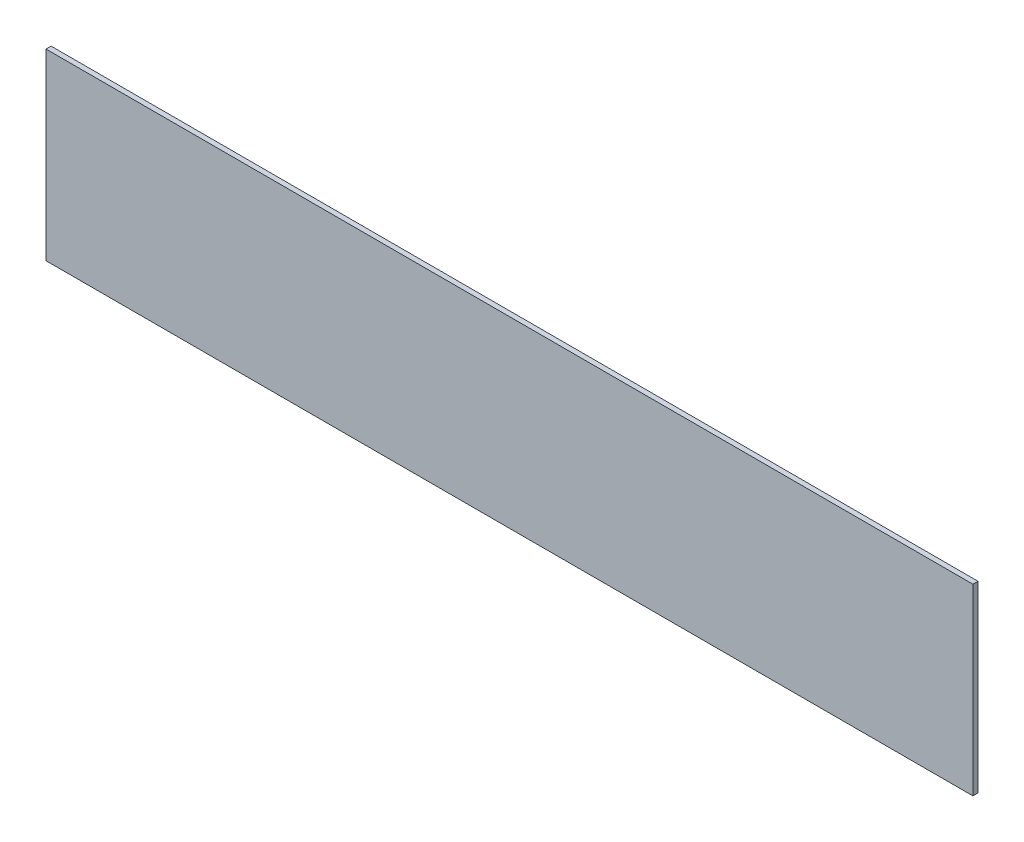
ISO-10303-21;
HEADER;
FILE_DESCRIPTION(('STEP AP214'),'2;1');
FILE_NAME('part.step','',(''),(''),'','','');
FILE_SCHEMA(('AUTOMOTIVE_DESIGN { 1 0 10303 214 1 1 1 1 }'));
ENDSEC;
DATA;
#1=APPLICATION_CONTEXT('core data for automotive mechanical design processes');
#2=APPLICATION_PROTOCOL_DEFINITION('international standard','automotive_design',2000,#1);
#3=PRODUCT_CONTEXT('',#1,'mechanical');
#4=PRODUCT('Part','Part','',(#3));
#5=PRODUCT_RELATED_PRODUCT_CATEGORY('part','',(#4));
#6=PRODUCT_DEFINITION_FORMATION('','',#4);
#7=PRODUCT_DEFINITION_CONTEXT('part definition',#1,'design');
#8=PRODUCT_DEFINITION('design','',#6,#7);
#9=PRODUCT_DEFINITION_SHAPE('','',#8);
#10=(LENGTH_UNIT() NAMED_UNIT(*) SI_UNIT(.MILLI.,.METRE.));
#11=(NAMED_UNIT(*) PLANE_ANGLE_UNIT() SI_UNIT($,.RADIAN.));
#12=(NAMED_UNIT(*) SI_UNIT($,.STERADIAN.) SOLID_ANGLE_UNIT());
#13=UNCERTAINTY_MEASURE_WITH_UNIT(LENGTH_MEASURE(1.E-05),#10,'distance_accuracy_value','');
#14=(GEOMETRIC_REPRESENTATION_CONTEXT(3) GLOBAL_UNCERTAINTY_ASSIGNED_CONTEXT((#13)) GLOBAL_UNIT_ASSIGNED_CONTEXT((#10,
#11,#12)) REPRESENTATION_CONTEXT('',''));
#15=CARTESIAN_POINT('',(0.,0.,0.));
#16=DIRECTION('',(0.,0.,1.));
#17=DIRECTION('',(1.,0.,0.));
#18=AXIS2_PLACEMENT_3D('',#15,#16,#17);
#19=CARTESIAN_POINT('',(259.,1337.,27.));
#20=DIRECTION('',(1.,0.,0.));
#21=DIRECTION('',(0.,0.,-1.));
#22=AXIS2_PLACEMENT_3D('',#19,#20,#21);
#23=PLANE('',#22);
#24=DIRECTION('',(0.,-1.,0.));
#25=VECTOR('',#24,1.);
#26=CARTESIAN_POINT('',(259.,1337.,26.));
#27=LINE('',#26,#25);
#28=CARTESIAN_POINT('',(259.,1373.,26.));
#29=VERTEX_POINT('',#28);
#30=CARTESIAN_POINT('',(259.,1337.,26.));
#31=VERTEX_POINT('',#30);
#32=EDGE_CURVE('E102',#29,#31,#27,.T.);
#33=ORIENTED_EDGE('',*,*,#32,.T.);
#34=DIRECTION('',(0.,0.,-1.));
#35=VECTOR('',#34,1.);
#36=CARTESIAN_POINT('',(259.,1337.,27.));
#37=LINE('',#36,#35);
#38=CARTESIAN_POINT('',(259.,1337.,27.));
#39=VERTEX_POINT('',#38);
#40=EDGE_CURVE('E11',#39,#31,#37,.T.);
#41=ORIENTED_EDGE('',*,*,#40,.F.);
#42=DIRECTION('',(0.,-1.,0.));
#43=VECTOR('',#42,1.);
#44=CARTESIAN_POINT('',(259.,1337.,27.));
#45=LINE('',#44,#43);
#46=CARTESIAN_POINT('',(259.,1373.,27.));
#47=VERTEX_POINT('',#46);
#48=EDGE_CURVE('E90',#47,#39,#45,.T.);
#49=ORIENTED_EDGE('',*,*,#48,.F.);
#50=DIRECTION('',(0.,0.,-1.));
#51=VECTOR('',#50,1.);
#52=CARTESIAN_POINT('',(259.,1373.,27.));
#53=LINE('',#52,#51);
#54=EDGE_CURVE('E98',#47,#29,#53,.T.);
#55=ORIENTED_EDGE('',*,*,#54,.T.);
#56=EDGE_LOOP('',(#33,#41,#49,#55));
#57=FACE_BOUND('',#56,.T.);
#58=ADVANCED_FACE('F39',(#57),#23,.F.);
#59=CARTESIAN_POINT('',(259.,1337.,27.));
#60=DIRECTION('',(0.,1.,0.));
#61=DIRECTION('',(0.,0.,1.));
#62=AXIS2_PLACEMENT_3D('',#59,#60,#61);
#63=PLANE('',#62);
#64=DIRECTION('',(1.,0.,0.));
#65=VECTOR('',#64,1.);
#66=CARTESIAN_POINT('',(259.,1337.,26.));
#67=LINE('',#66,#65);
#68=CARTESIAN_POINT('',(441.,1337.,26.));
#69=VERTEX_POINT('',#68);
#70=EDGE_CURVE('E94',#31,#69,#67,.T.);
#71=ORIENTED_EDGE('',*,*,#70,.T.);
#72=DIRECTION('',(0.,0.,-1.));
#73=VECTOR('',#72,1.);
#74=CARTESIAN_POINT('',(441.,1337.,27.));
#75=LINE('',#74,#73);
#76=CARTESIAN_POINT('',(441.,1337.,27.));
#77=VERTEX_POINT('',#76);
#78=EDGE_CURVE('E47',#77,#69,#75,.T.);
#79=ORIENTED_EDGE('',*,*,#78,.F.);
#80=DIRECTION('',(1.,0.,0.));
#81=VECTOR('',#80,1.);
#82=CARTESIAN_POINT('',(259.,1337.,27.));
#83=LINE('',#82,#81);
#84=EDGE_CURVE('E85',#39,#77,#83,.T.);
#85=ORIENTED_EDGE('',*,*,#84,.F.);
#86=ORIENTED_EDGE('',*,*,#40,.T.);
#87=EDGE_LOOP('',(#71,#79,#85,#86));
#88=FACE_BOUND('',#87,.T.);
#89=ADVANCED_FACE('F93',(#88),#63,.F.);
#90=CARTESIAN_POINT('',(441.,1337.,27.));
#91=DIRECTION('',(-1.,0.,0.));
#92=DIRECTION('',(0.,0.,1.));
#93=AXIS2_PLACEMENT_3D('',#90,#91,#92);
#94=PLANE('',#93);
#95=DIRECTION('',(0.,1.,0.));
#96=VECTOR('',#95,1.);
#97=CARTESIAN_POINT('',(441.,1337.,26.));
#98=LINE('',#97,#96);
#99=CARTESIAN_POINT('',(441.,1373.,26.));
#100=VERTEX_POINT('',#99);
#101=EDGE_CURVE('E72',#69,#100,#98,.T.);
#102=ORIENTED_EDGE('',*,*,#101,.T.);
#103=DIRECTION('',(0.,0.,-1.));
#104=VECTOR('',#103,1.);
#105=CARTESIAN_POINT('',(441.,1373.,27.));
#106=LINE('',#105,#104);
#107=CARTESIAN_POINT('',(441.,1373.,27.));
#108=VERTEX_POINT('',#107);
#109=EDGE_CURVE('E95',#108,#100,#106,.T.);
#110=ORIENTED_EDGE('',*,*,#109,.F.);
#111=DIRECTION('',(0.,1.,0.));
#112=VECTOR('',#111,1.);
#113=CARTESIAN_POINT('',(441.,1337.,27.));
#114=LINE('',#113,#112);
#115=EDGE_CURVE('E88',#77,#108,#114,.T.);
#116=ORIENTED_EDGE('',*,*,#115,.F.);
#117=ORIENTED_EDGE('',*,*,#78,.T.);
#118=EDGE_LOOP('',(#102,#110,#116,#117));
#119=FACE_BOUND('',#118,.T.);
#120=ADVANCED_FACE('F96',(#119),#94,.F.);
#121=CARTESIAN_POINT('',(259.,1373.,27.));
#122=DIRECTION('',(0.,-1.,0.));
#123=DIRECTION('',(0.,0.,-1.));
#124=AXIS2_PLACEMENT_3D('',#121,#122,#123);
#125=PLANE('',#124);
#126=DIRECTION('',(-1.,0.,0.));
#127=VECTOR('',#126,1.);
#128=CARTESIAN_POINT('',(259.,1373.,26.));
#129=LINE('',#128,#127);
#130=EDGE_CURVE('E78',#100,#29,#129,.T.);
#131=ORIENTED_EDGE('',*,*,#130,.T.);
#132=ORIENTED_EDGE('',*,*,#54,.F.);
#133=DIRECTION('',(-1.,0.,0.));
#134=VECTOR('',#133,1.);
#135=CARTESIAN_POINT('',(259.,1373.,27.));
#136=LINE('',#135,#134);
#137=EDGE_CURVE('E55',#108,#47,#136,.T.);
#138=ORIENTED_EDGE('',*,*,#137,.F.);
#139=ORIENTED_EDGE('',*,*,#109,.T.);
#140=EDGE_LOOP('',(#131,#132,#138,#139));
#141=FACE_BOUND('',#140,.T.);
#142=ADVANCED_FACE('F109',(#141),#125,.F.);
#143=CARTESIAN_POINT('',(0.,0.,27.));
#144=DIRECTION('',(0.,0.,-1.));
#145=DIRECTION('',(-1.,0.,0.));
#146=AXIS2_PLACEMENT_3D('',#143,#144,#145);
#147=PLANE('',#146);
#148=ORIENTED_EDGE('',*,*,#48,.T.);
#149=ORIENTED_EDGE('',*,*,#84,.T.);
#150=ORIENTED_EDGE('',*,*,#115,.T.);
#151=ORIENTED_EDGE('',*,*,#137,.T.);
#152=EDGE_LOOP('',(#148,#149,#150,#151));
#153=FACE_BOUND('',#152,.T.);
#154=ADVANCED_FACE('F86',(#153),#147,.F.);
#155=CARTESIAN_POINT('',(0.,0.,26.));
#156=DIRECTION('',(0.,0.,-1.));
#157=DIRECTION('',(-1.,0.,0.));
#158=AXIS2_PLACEMENT_3D('',#155,#156,#157);
#159=PLANE('',#158);
#160=ORIENTED_EDGE('',*,*,#32,.F.);
#161=ORIENTED_EDGE('',*,*,#130,.F.);
#162=ORIENTED_EDGE('',*,*,#101,.F.);
#163=ORIENTED_EDGE('',*,*,#70,.F.);
#164=EDGE_LOOP('',(#160,#161,#162,#163));
#165=FACE_BOUND('',#164,.T.);
#166=ADVANCED_FACE('F112',(#165),#159,.T.);
#167=CLOSED_SHELL('',(#58,#89,#120,#142,#154,#166));
#168=MANIFOLD_SOLID_BREP('B2',#167);
#169=ADVANCED_BREP_SHAPE_REPRESENTATION('',(#18,#168),#14);
#170=SHAPE_DEFINITION_REPRESENTATION(#9,#169);
ENDSEC;
END-ISO-10303-21;
